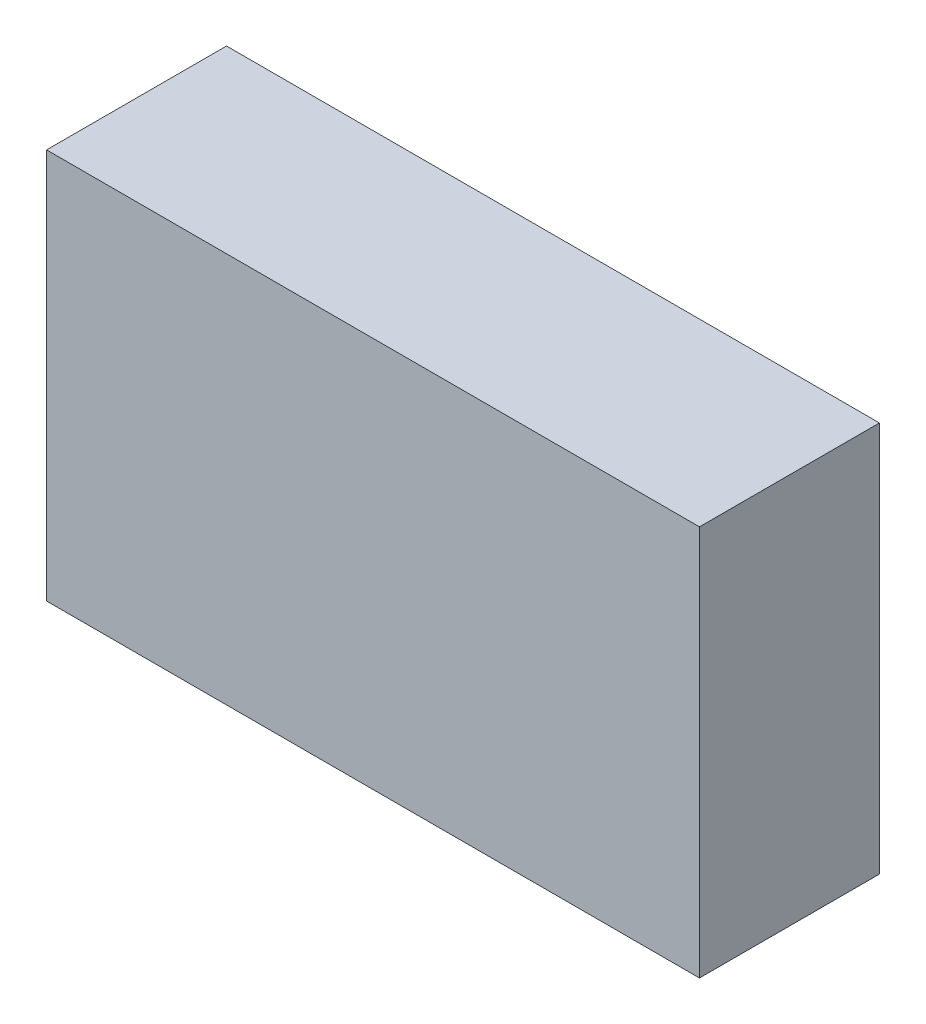
ISO-10303-21;
HEADER;
FILE_DESCRIPTION(('STEP AP214'),'2;1');
FILE_NAME('part.step','',(''),(''),'','','');
FILE_SCHEMA(('AUTOMOTIVE_DESIGN { 1 0 10303 214 1 1 1 1 }'));
ENDSEC;
DATA;
#1=APPLICATION_CONTEXT('core data for automotive mechanical design processes');
#2=APPLICATION_PROTOCOL_DEFINITION('international standard','automotive_design',2000,#1);
#3=PRODUCT_CONTEXT('',#1,'mechanical');
#4=PRODUCT('Part','Part','',(#3));
#5=PRODUCT_RELATED_PRODUCT_CATEGORY('part','',(#4));
#6=PRODUCT_DEFINITION_FORMATION('','',#4);
#7=PRODUCT_DEFINITION_CONTEXT('part definition',#1,'design');
#8=PRODUCT_DEFINITION('design','',#6,#7);
#9=PRODUCT_DEFINITION_SHAPE('','',#8);
#10=(LENGTH_UNIT() NAMED_UNIT(*) SI_UNIT(.MILLI.,.METRE.));
#11=(NAMED_UNIT(*) PLANE_ANGLE_UNIT() SI_UNIT($,.RADIAN.));
#12=(NAMED_UNIT(*) SI_UNIT($,.STERADIAN.) SOLID_ANGLE_UNIT());
#13=UNCERTAINTY_MEASURE_WITH_UNIT(LENGTH_MEASURE(1.E-05),#10,'distance_accuracy_value','');
#14=(GEOMETRIC_REPRESENTATION_CONTEXT(3) GLOBAL_UNCERTAINTY_ASSIGNED_CONTEXT((#13)) GLOBAL_UNIT_ASSIGNED_CONTEXT((#10,
#11,#12)) REPRESENTATION_CONTEXT('',''));
#15=CARTESIAN_POINT('',(0.,0.,0.));
#16=DIRECTION('',(0.,0.,1.));
#17=DIRECTION('',(1.,0.,0.));
#18=AXIS2_PLACEMENT_3D('',#15,#16,#17);
#19=CARTESIAN_POINT('',(63.5,38.,35.));
#20=DIRECTION('',(-1.,0.,0.));
#21=DIRECTION('',(0.,0.,1.));
#22=AXIS2_PLACEMENT_3D('',#19,#20,#21);
#23=PLANE('',#22);
#24=DIRECTION('',(0.,1.,0.));
#25=VECTOR('',#24,1.);
#26=CARTESIAN_POINT('',(63.5,38.,0.));
#27=LINE('',#26,#25);
#28=CARTESIAN_POINT('',(63.5,-38.,0.));
#29=VERTEX_POINT('',#28);
#30=CARTESIAN_POINT('',(63.5,38.,0.));
#31=VERTEX_POINT('',#30);
#32=EDGE_CURVE('E102',#29,#31,#27,.T.);
#33=ORIENTED_EDGE('',*,*,#32,.T.);
#34=DIRECTION('',(0.,0.,-1.));
#35=VECTOR('',#34,1.);
#36=CARTESIAN_POINT('',(63.5,38.,35.));
#37=LINE('',#36,#35);
#38=CARTESIAN_POINT('',(63.5,38.,35.));
#39=VERTEX_POINT('',#38);
#40=EDGE_CURVE('E11',#39,#31,#37,.T.);
#41=ORIENTED_EDGE('',*,*,#40,.F.);
#42=DIRECTION('',(0.,1.,0.));
#43=VECTOR('',#42,1.);
#44=CARTESIAN_POINT('',(63.5,38.,35.));
#45=LINE('',#44,#43);
#46=CARTESIAN_POINT('',(63.5,-38.,35.));
#47=VERTEX_POINT('',#46);
#48=EDGE_CURVE('E90',#47,#39,#45,.T.);
#49=ORIENTED_EDGE('',*,*,#48,.F.);
#50=DIRECTION('',(0.,0.,-1.));
#51=VECTOR('',#50,1.);
#52=CARTESIAN_POINT('',(63.5,-38.,35.));
#53=LINE('',#52,#51);
#54=EDGE_CURVE('E98',#47,#29,#53,.T.);
#55=ORIENTED_EDGE('',*,*,#54,.T.);
#56=EDGE_LOOP('',(#33,#41,#49,#55));
#57=FACE_BOUND('',#56,.T.);
#58=ADVANCED_FACE('F39',(#57),#23,.F.);
#59=CARTESIAN_POINT('',(-63.5,38.,35.));
#60=DIRECTION('',(0.,-1.,0.));
#61=DIRECTION('',(0.,0.,-1.));
#62=AXIS2_PLACEMENT_3D('',#59,#60,#61);
#63=PLANE('',#62);
#64=DIRECTION('',(-1.,0.,0.));
#65=VECTOR('',#64,1.);
#66=CARTESIAN_POINT('',(-63.5,38.,0.));
#67=LINE('',#66,#65);
#68=CARTESIAN_POINT('',(-63.5,38.,0.));
#69=VERTEX_POINT('',#68);
#70=EDGE_CURVE('E94',#31,#69,#67,.T.);
#71=ORIENTED_EDGE('',*,*,#70,.T.);
#72=DIRECTION('',(0.,0.,-1.));
#73=VECTOR('',#72,1.);
#74=CARTESIAN_POINT('',(-63.5,38.,35.));
#75=LINE('',#74,#73);
#76=CARTESIAN_POINT('',(-63.5,38.,35.));
#77=VERTEX_POINT('',#76);
#78=EDGE_CURVE('E47',#77,#69,#75,.T.);
#79=ORIENTED_EDGE('',*,*,#78,.F.);
#80=DIRECTION('',(-1.,0.,0.));
#81=VECTOR('',#80,1.);
#82=CARTESIAN_POINT('',(-63.5,38.,35.));
#83=LINE('',#82,#81);
#84=EDGE_CURVE('E85',#39,#77,#83,.T.);
#85=ORIENTED_EDGE('',*,*,#84,.F.);
#86=ORIENTED_EDGE('',*,*,#40,.T.);
#87=EDGE_LOOP('',(#71,#79,#85,#86));
#88=FACE_BOUND('',#87,.T.);
#89=ADVANCED_FACE('F93',(#88),#63,.F.);
#90=CARTESIAN_POINT('',(-63.5,38.,35.));
#91=DIRECTION('',(1.,0.,0.));
#92=DIRECTION('',(0.,0.,-1.));
#93=AXIS2_PLACEMENT_3D('',#90,#91,#92);
#94=PLANE('',#93);
#95=DIRECTION('',(0.,-1.,0.));
#96=VECTOR('',#95,1.);
#97=CARTESIAN_POINT('',(-63.5,38.,0.));
#98=LINE('',#97,#96);
#99=CARTESIAN_POINT('',(-63.5,-38.,0.));
#100=VERTEX_POINT('',#99);
#101=EDGE_CURVE('E72',#69,#100,#98,.T.);
#102=ORIENTED_EDGE('',*,*,#101,.T.);
#103=DIRECTION('',(0.,0.,-1.));
#104=VECTOR('',#103,1.);
#105=CARTESIAN_POINT('',(-63.5,-38.,35.));
#106=LINE('',#105,#104);
#107=CARTESIAN_POINT('',(-63.5,-38.,35.));
#108=VERTEX_POINT('',#107);
#109=EDGE_CURVE('E95',#108,#100,#106,.T.);
#110=ORIENTED_EDGE('',*,*,#109,.F.);
#111=DIRECTION('',(0.,-1.,0.));
#112=VECTOR('',#111,1.);
#113=CARTESIAN_POINT('',(-63.5,38.,35.));
#114=LINE('',#113,#112);
#115=EDGE_CURVE('E88',#77,#108,#114,.T.);
#116=ORIENTED_EDGE('',*,*,#115,.F.);
#117=ORIENTED_EDGE('',*,*,#78,.T.);
#118=EDGE_LOOP('',(#102,#110,#116,#117));
#119=FACE_BOUND('',#118,.T.);
#120=ADVANCED_FACE('F96',(#119),#94,.F.);
#121=CARTESIAN_POINT('',(-63.5,-38.,35.));
#122=DIRECTION('',(0.,1.,0.));
#123=DIRECTION('',(0.,0.,1.));
#124=AXIS2_PLACEMENT_3D('',#121,#122,#123);
#125=PLANE('',#124);
#126=DIRECTION('',(1.,0.,0.));
#127=VECTOR('',#126,1.);
#128=CARTESIAN_POINT('',(-63.5,-38.,0.));
#129=LINE('',#128,#127);
#130=EDGE_CURVE('E78',#100,#29,#129,.T.);
#131=ORIENTED_EDGE('',*,*,#130,.T.);
#132=ORIENTED_EDGE('',*,*,#54,.F.);
#133=DIRECTION('',(1.,0.,0.));
#134=VECTOR('',#133,1.);
#135=CARTESIAN_POINT('',(-63.5,-38.,35.));
#136=LINE('',#135,#134);
#137=EDGE_CURVE('E55',#108,#47,#136,.T.);
#138=ORIENTED_EDGE('',*,*,#137,.F.);
#139=ORIENTED_EDGE('',*,*,#109,.T.);
#140=EDGE_LOOP('',(#131,#132,#138,#139));
#141=FACE_BOUND('',#140,.T.);
#142=ADVANCED_FACE('F109',(#141),#125,.F.);
#143=CARTESIAN_POINT('',(0.,0.,35.));
#144=DIRECTION('',(0.,0.,1.));
#145=DIRECTION('',(1.,0.,0.));
#146=AXIS2_PLACEMENT_3D('',#143,#144,#145);
#147=PLANE('',#146);
#148=ORIENTED_EDGE('',*,*,#48,.T.);
#149=ORIENTED_EDGE('',*,*,#84,.T.);
#150=ORIENTED_EDGE('',*,*,#115,.T.);
#151=ORIENTED_EDGE('',*,*,#137,.T.);
#152=EDGE_LOOP('',(#148,#149,#150,#151));
#153=FACE_BOUND('',#152,.T.);
#154=ADVANCED_FACE('F86',(#153),#147,.T.);
#155=CARTESIAN_POINT('',(0.,0.,0.));
#156=DIRECTION('',(0.,0.,1.));
#157=DIRECTION('',(1.,0.,0.));
#158=AXIS2_PLACEMENT_3D('',#155,#156,#157);
#159=PLANE('',#158);
#160=ORIENTED_EDGE('',*,*,#32,.F.);
#161=ORIENTED_EDGE('',*,*,#130,.F.);
#162=ORIENTED_EDGE('',*,*,#101,.F.);
#163=ORIENTED_EDGE('',*,*,#70,.F.);
#164=EDGE_LOOP('',(#160,#161,#162,#163));
#165=FACE_BOUND('',#164,.T.);
#166=ADVANCED_FACE('F112',(#165),#159,.F.);
#167=CLOSED_SHELL('',(#58,#89,#120,#142,#154,#166));
#168=MANIFOLD_SOLID_BREP('B2',#167);
#169=ADVANCED_BREP_SHAPE_REPRESENTATION('',(#18,#168),#14);
#170=SHAPE_DEFINITION_REPRESENTATION(#9,#169);
ENDSEC;
END-ISO-10303-21;
